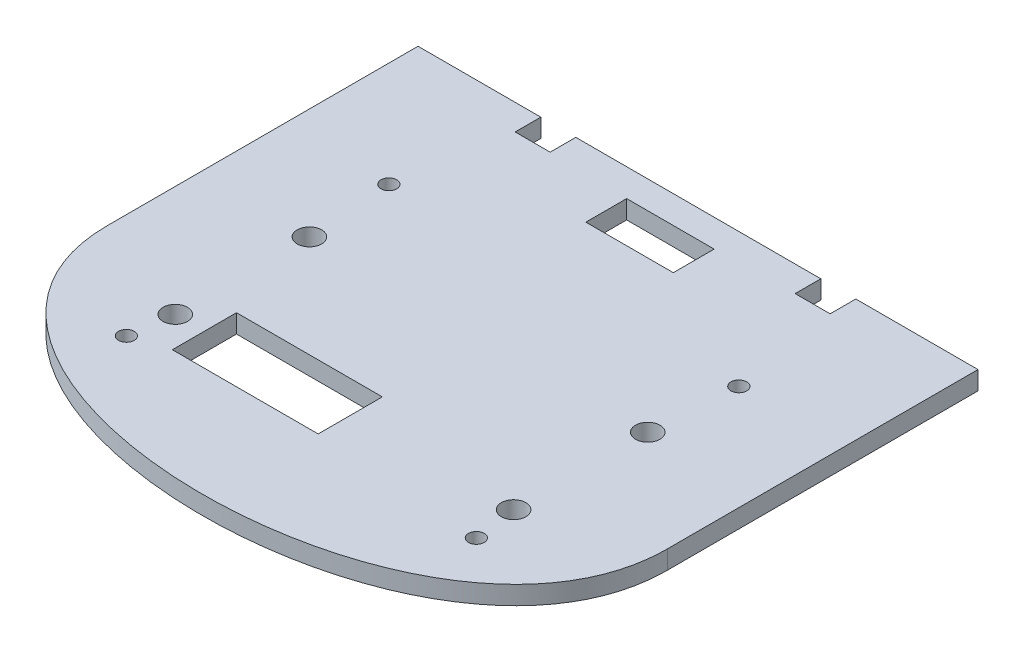
ISO-10303-21;
HEADER;
FILE_DESCRIPTION(('STEP AP214'),'2;1');
FILE_NAME('part.step','',(''),(''),'','','');
FILE_SCHEMA(('AUTOMOTIVE_DESIGN { 1 0 10303 214 1 1 1 1 }'));
ENDSEC;
DATA;
#1=APPLICATION_CONTEXT('core data for automotive mechanical design processes');
#2=APPLICATION_PROTOCOL_DEFINITION('international standard','automotive_design',2000,#1);
#3=PRODUCT_CONTEXT('',#1,'mechanical');
#4=PRODUCT('Part','Part','',(#3));
#5=PRODUCT_RELATED_PRODUCT_CATEGORY('part','',(#4));
#6=PRODUCT_DEFINITION_FORMATION('','',#4);
#7=PRODUCT_DEFINITION_CONTEXT('part definition',#1,'design');
#8=PRODUCT_DEFINITION('design','',#6,#7);
#9=PRODUCT_DEFINITION_SHAPE('','',#8);
#10=(LENGTH_UNIT() NAMED_UNIT(*) SI_UNIT(.MILLI.,.METRE.));
#11=(NAMED_UNIT(*) PLANE_ANGLE_UNIT() SI_UNIT($,.RADIAN.));
#12=(NAMED_UNIT(*) SI_UNIT($,.STERADIAN.) SOLID_ANGLE_UNIT());
#13=UNCERTAINTY_MEASURE_WITH_UNIT(LENGTH_MEASURE(1.E-05),#10,'distance_accuracy_value','');
#14=(GEOMETRIC_REPRESENTATION_CONTEXT(3) GLOBAL_UNCERTAINTY_ASSIGNED_CONTEXT((#13)) GLOBAL_UNIT_ASSIGNED_CONTEXT((#10,
#11,#12)) REPRESENTATION_CONTEXT('',''));
#15=CARTESIAN_POINT('',(0.,0.,0.));
#16=DIRECTION('',(0.,0.,1.));
#17=DIRECTION('',(1.,0.,0.));
#18=AXIS2_PLACEMENT_3D('',#15,#16,#17);
#19=CARTESIAN_POINT('',(48.,3.175,-42.5));
#20=DIRECTION('',(0.,0.,1.));
#21=DIRECTION('',(1.,0.,0.));
#22=AXIS2_PLACEMENT_3D('',#19,#20,#21);
#23=PLANE('',#22);
#24=DIRECTION('',(-1.,0.,0.));
#25=VECTOR('',#24,1.);
#26=CARTESIAN_POINT('',(48.,3.175,-42.5));
#27=LINE('',#26,#25);
#28=CARTESIAN_POINT('',(21.051144598735,3.175,-42.5));
#29=VERTEX_POINT('',#28);
#30=CARTESIAN_POINT('',(-20.948855401265,3.175,-42.4999999999998));
#31=VERTEX_POINT('',#30);
#32=EDGE_CURVE('E542',#29,#31,#27,.T.);
#33=ORIENTED_EDGE('',*,*,#32,.F.);
#34=DIRECTION('',(0.,1.,0.));
#35=VECTOR('',#34,1.);
#36=CARTESIAN_POINT('',(21.051144598735,0.,-42.5));
#37=LINE('',#36,#35);
#38=CARTESIAN_POINT('',(21.051144598735,0.,-42.5));
#39=VERTEX_POINT('',#38);
#40=EDGE_CURVE('E215',#39,#29,#37,.T.);
#41=ORIENTED_EDGE('',*,*,#40,.F.);
#42=DIRECTION('',(-1.,0.,0.));
#43=VECTOR('',#42,1.);
#44=CARTESIAN_POINT('',(48.,0.,-42.5));
#45=LINE('',#44,#43);
#46=CARTESIAN_POINT('',(-20.948855401265,0.,-42.4999999999998));
#47=VERTEX_POINT('',#46);
#48=EDGE_CURVE('E200',#39,#47,#45,.T.);
#49=ORIENTED_EDGE('',*,*,#48,.T.);
#50=DIRECTION('',(0.,1.,0.));
#51=VECTOR('',#50,1.);
#52=CARTESIAN_POINT('',(-20.948855401265,0.,-42.4999999999998));
#53=LINE('',#52,#51);
#54=EDGE_CURVE('E249',#47,#31,#53,.T.);
#55=ORIENTED_EDGE('',*,*,#54,.T.);
#56=EDGE_LOOP('',(#33,#41,#49,#55));
#57=FACE_BOUND('',#56,.T.);
#58=ADVANCED_FACE('F39',(#57),#23,.F.);
#59=CARTESIAN_POINT('',(-26.948855401265,3.175,-42.4999999999998));
#60=VERTEX_POINT('',#59);
#61=CARTESIAN_POINT('',(-48.,3.175,-42.5));
#62=VERTEX_POINT('',#61);
#63=EDGE_CURVE('E547',#60,#62,#27,.T.);
#64=ORIENTED_EDGE('',*,*,#63,.F.);
#65=DIRECTION('',(0.,1.,0.));
#66=VECTOR('',#65,1.);
#67=CARTESIAN_POINT('',(-26.948855401265,0.,-42.4999999999998));
#68=LINE('',#67,#66);
#69=CARTESIAN_POINT('',(-26.948855401265,0.,-42.4999999999998));
#70=VERTEX_POINT('',#69);
#71=EDGE_CURVE('E212',#70,#60,#68,.T.);
#72=ORIENTED_EDGE('',*,*,#71,.F.);
#73=CARTESIAN_POINT('',(-48.,0.,-42.5));
#74=VERTEX_POINT('',#73);
#75=EDGE_CURVE('E567',#70,#74,#45,.T.);
#76=ORIENTED_EDGE('',*,*,#75,.T.);
#77=DIRECTION('',(0.,-1.,0.));
#78=VECTOR('',#77,1.);
#79=CARTESIAN_POINT('',(-48.,3.175,-42.5));
#80=LINE('',#79,#78);
#81=EDGE_CURVE('E551',#62,#74,#80,.T.);
#82=ORIENTED_EDGE('',*,*,#81,.F.);
#83=EDGE_LOOP('',(#64,#72,#76,#82));
#84=FACE_BOUND('',#83,.T.);
#85=ADVANCED_FACE('F445',(#84),#23,.F.);
#86=CARTESIAN_POINT('',(-48.,3.175,-42.5));
#87=DIRECTION('',(1.,0.,0.));
#88=DIRECTION('',(0.,0.,-1.));
#89=AXIS2_PLACEMENT_3D('',#86,#87,#88);
#90=PLANE('',#89);
#91=DIRECTION('',(0.,0.,1.));
#92=VECTOR('',#91,1.);
#93=CARTESIAN_POINT('',(-48.,0.,-42.5));
#94=LINE('',#93,#92);
#95=CARTESIAN_POINT('',(-48.,0.,10.75));
#96=VERTEX_POINT('',#95);
#97=EDGE_CURVE('E415',#74,#96,#94,.T.);
#98=ORIENTED_EDGE('',*,*,#97,.T.);
#99=DIRECTION('',(0.,-1.,0.));
#100=VECTOR('',#99,1.);
#101=CARTESIAN_POINT('',(-48.,3.175,10.75));
#102=LINE('',#101,#100);
#103=CARTESIAN_POINT('',(-48.,3.175,10.75));
#104=VERTEX_POINT('',#103);
#105=EDGE_CURVE('E11',#104,#96,#102,.T.);
#106=ORIENTED_EDGE('',*,*,#105,.F.);
#107=DIRECTION('',(0.,0.,1.));
#108=VECTOR('',#107,1.);
#109=CARTESIAN_POINT('',(-48.,3.175,-42.5));
#110=LINE('',#109,#108);
#111=EDGE_CURVE('E416',#62,#104,#110,.T.);
#112=ORIENTED_EDGE('',*,*,#111,.F.);
#113=ORIENTED_EDGE('',*,*,#81,.T.);
#114=EDGE_LOOP('',(#98,#106,#112,#113));
#115=FACE_BOUND('',#114,.T.);
#116=ADVANCED_FACE('F41',(#115),#90,.F.);
#117=CARTESIAN_POINT('',(-48.,3.175,10.75));
#118=CARTESIAN_POINT('',(-48.,3.175,53.0833333333333));
#119=CARTESIAN_POINT('',(48.0000000000003,3.175,53.0833333333333));
#120=CARTESIAN_POINT('',(48.,3.175,10.75));
#121=B_SPLINE_CURVE_WITH_KNOTS('',3,(#117,#118,#119,#120),.UNSPECIFIED.,.F.,.F.,(4,4),(0.,1.),.UNSPECIFIED.);
#122=DIRECTION('',(0.,-1.,0.));
#123=VECTOR('',#122,1.);
#124=SURFACE_OF_LINEAR_EXTRUSION('',#121,#123);
#125=CARTESIAN_POINT('',(-48.,0.,10.75));
#126=CARTESIAN_POINT('',(-48.,0.,53.0833333333333));
#127=CARTESIAN_POINT('',(48.0000000000003,0.,53.0833333333333));
#128=CARTESIAN_POINT('',(48.,0.,10.75));
#129=B_SPLINE_CURVE_WITH_KNOTS('',3,(#125,#126,#127,#128),.UNSPECIFIED.,.F.,.F.,(4,4),(0.,1.),.UNSPECIFIED.);
#130=CARTESIAN_POINT('',(48.,0.,10.75));
#131=VERTEX_POINT('',#130);
#132=EDGE_CURVE('E556',#96,#131,#129,.T.);
#133=ORIENTED_EDGE('',*,*,#132,.T.);
#134=DIRECTION('',(0.,-1.,0.));
#135=VECTOR('',#134,1.);
#136=CARTESIAN_POINT('',(48.,3.175,10.75));
#137=LINE('',#136,#135);
#138=CARTESIAN_POINT('',(48.,3.175,10.75));
#139=VERTEX_POINT('',#138);
#140=EDGE_CURVE('E48',#139,#131,#137,.T.);
#141=ORIENTED_EDGE('',*,*,#140,.F.);
#142=EDGE_CURVE('E420',#104,#139,#121,.T.);
#143=ORIENTED_EDGE('',*,*,#142,.F.);
#144=ORIENTED_EDGE('',*,*,#105,.T.);
#145=EDGE_LOOP('',(#133,#141,#143,#144));
#146=FACE_BOUND('',#145,.T.);
#147=ADVANCED_FACE('F432',(#146),#124,.F.);
#148=CARTESIAN_POINT('',(48.,3.175,-42.5));
#149=DIRECTION('',(-1.,0.,0.));
#150=DIRECTION('',(0.,0.,1.));
#151=AXIS2_PLACEMENT_3D('',#148,#149,#150);
#152=PLANE('',#151);
#153=DIRECTION('',(0.,0.,-1.));
#154=VECTOR('',#153,1.);
#155=CARTESIAN_POINT('',(48.,0.,-42.5));
#156=LINE('',#155,#154);
#157=CARTESIAN_POINT('',(48.,0.,-42.5));
#158=VERTEX_POINT('',#157);
#159=EDGE_CURVE('E561',#131,#158,#156,.T.);
#160=ORIENTED_EDGE('',*,*,#159,.T.);
#161=DIRECTION('',(0.,-1.,0.));
#162=VECTOR('',#161,1.);
#163=CARTESIAN_POINT('',(48.,3.175,-42.5));
#164=LINE('',#163,#162);
#165=CARTESIAN_POINT('',(48.,3.175,-42.5));
#166=VERTEX_POINT('',#165);
#167=EDGE_CURVE('E574',#166,#158,#164,.T.);
#168=ORIENTED_EDGE('',*,*,#167,.F.);
#169=DIRECTION('',(0.,0.,-1.));
#170=VECTOR('',#169,1.);
#171=CARTESIAN_POINT('',(48.,3.175,-42.5));
#172=LINE('',#171,#170);
#173=EDGE_CURVE('E427',#139,#166,#172,.T.);
#174=ORIENTED_EDGE('',*,*,#173,.F.);
#175=ORIENTED_EDGE('',*,*,#140,.T.);
#176=EDGE_LOOP('',(#160,#168,#174,#175));
#177=FACE_BOUND('',#176,.T.);
#178=ADVANCED_FACE('F435',(#177),#152,.F.);
#179=CARTESIAN_POINT('',(27.051144598735,0.,-42.5));
#180=VERTEX_POINT('',#179);
#181=EDGE_CURVE('E421',#158,#180,#45,.T.);
#182=ORIENTED_EDGE('',*,*,#181,.T.);
#183=DIRECTION('',(0.,1.,0.));
#184=VECTOR('',#183,1.);
#185=CARTESIAN_POINT('',(27.051144598735,0.,-42.5));
#186=LINE('',#185,#184);
#187=CARTESIAN_POINT('',(27.051144598735,3.175,-42.5));
#188=VERTEX_POINT('',#187);
#189=EDGE_CURVE('E219',#180,#188,#186,.T.);
#190=ORIENTED_EDGE('',*,*,#189,.T.);
#191=EDGE_CURVE('E546',#166,#188,#27,.T.);
#192=ORIENTED_EDGE('',*,*,#191,.F.);
#193=ORIENTED_EDGE('',*,*,#167,.T.);
#194=EDGE_LOOP('',(#182,#190,#192,#193));
#195=FACE_BOUND('',#194,.T.);
#196=ADVANCED_FACE('F439',(#195),#23,.F.);
#197=CARTESIAN_POINT('',(1.196959198424E-13,3.175,42.5));
#198=DIRECTION('',(0.,-1.,0.));
#199=DIRECTION('',(0.,0.,-1.));
#200=AXIS2_PLACEMENT_3D('',#197,#198,#199);
#201=PLANE('',#200);
#202=CARTESIAN_POINT('',(29.,3.175,18.1187367018033));
#203=DIRECTION('',(0.,-1.,0.));
#204=DIRECTION('',(0.,0.,-1.));
#205=AXIS2_PLACEMENT_3D('',#202,#203,#204);
#206=CIRCLE('',#205,2.1);
#207=CARTESIAN_POINT('',(29.,3.175,16.0187367018033));
#208=VERTEX_POINT('',#207);
#209=EDGE_CURVE('E411',#208,#208,#206,.T.);
#210=ORIENTED_EDGE('',*,*,#209,.T.);
#211=EDGE_LOOP('',(#210));
#212=FACE_BOUND('',#211,.T.);
#213=CARTESIAN_POINT('',(-30.,3.175,25.5));
#214=DIRECTION('',(0.,-1.,0.));
#215=DIRECTION('',(0.,0.,-1.));
#216=AXIS2_PLACEMENT_3D('',#213,#214,#215);
#217=CIRCLE('',#216,1.35000000000001);
#218=CARTESIAN_POINT('',(-30.,3.175,24.15));
#219=VERTEX_POINT('',#218);
#220=EDGE_CURVE('E407',#219,#219,#217,.T.);
#221=ORIENTED_EDGE('',*,*,#220,.T.);
#222=EDGE_LOOP('',(#221));
#223=FACE_BOUND('',#222,.T.);
#224=CARTESIAN_POINT('',(30.,3.175,25.5));
#225=DIRECTION('',(0.,-1.,0.));
#226=DIRECTION('',(0.,0.,-1.));
#227=AXIS2_PLACEMENT_3D('',#224,#225,#226);
#228=CIRCLE('',#227,1.35000000000001);
#229=CARTESIAN_POINT('',(30.,3.175,24.15));
#230=VERTEX_POINT('',#229);
#231=EDGE_CURVE('E403',#230,#230,#228,.T.);
#232=ORIENTED_EDGE('',*,*,#231,.T.);
#233=EDGE_LOOP('',(#232));
#234=FACE_BOUND('',#233,.T.);
#235=CARTESIAN_POINT('',(30.,3.175,-19.5));
#236=DIRECTION('',(0.,-1.,0.));
#237=DIRECTION('',(0.,0.,-1.));
#238=AXIS2_PLACEMENT_3D('',#235,#236,#237);
#239=CIRCLE('',#238,1.35);
#240=CARTESIAN_POINT('',(30.,3.175,-20.85));
#241=VERTEX_POINT('',#240);
#242=EDGE_CURVE('E399',#241,#241,#239,.T.);
#243=ORIENTED_EDGE('',*,*,#242,.T.);
#244=EDGE_LOOP('',(#243));
#245=FACE_BOUND('',#244,.T.);
#246=DIRECTION('',(1.,0.,0.));
#247=VECTOR('',#246,1.);
#248=CARTESIAN_POINT('',(1.56825963677274E-13,3.175,-37.7650487579144));
#249=LINE('',#248,#247);
#250=CARTESIAN_POINT('',(-7.5,3.175,-37.7650487579144));
#251=VERTEX_POINT('',#250);
#252=CARTESIAN_POINT('',(7.5,3.175,-37.7650487579144));
#253=VERTEX_POINT('',#252);
#254=EDGE_CURVE('E383',#251,#253,#249,.T.);
#255=ORIENTED_EDGE('',*,*,#254,.T.);
#256=DIRECTION('',(0.,0.,1.));
#257=VECTOR('',#256,1.);
#258=CARTESIAN_POINT('',(7.50000000000002,3.175,42.5));
#259=LINE('',#258,#257);
#260=CARTESIAN_POINT('',(7.5,3.175,-30.7650487579144));
#261=VERTEX_POINT('',#260);
#262=EDGE_CURVE('E395',#253,#261,#259,.T.);
#263=ORIENTED_EDGE('',*,*,#262,.T.);
#264=DIRECTION('',(-1.,0.,0.));
#265=VECTOR('',#264,1.);
#266=CARTESIAN_POINT('',(0.,3.175,-30.7650487579144));
#267=LINE('',#266,#265);
#268=CARTESIAN_POINT('',(-7.5,3.175,-30.7650487579144));
#269=VERTEX_POINT('',#268);
#270=EDGE_CURVE('E391',#261,#269,#267,.T.);
#271=ORIENTED_EDGE('',*,*,#270,.T.);
#272=DIRECTION('',(0.,0.,-1.));
#273=VECTOR('',#272,1.);
#274=CARTESIAN_POINT('',(-7.5,3.175,42.5));
#275=LINE('',#274,#273);
#276=EDGE_CURVE('E387',#269,#251,#275,.T.);
#277=ORIENTED_EDGE('',*,*,#276,.T.);
#278=EDGE_LOOP('',(#255,#263,#271,#277));
#279=FACE_BOUND('',#278,.T.);
#280=CARTESIAN_POINT('',(-29.,3.175,-4.88126329819669));
#281=DIRECTION('',(0.,-1.,0.));
#282=DIRECTION('',(0.,0.,-1.));
#283=AXIS2_PLACEMENT_3D('',#280,#281,#282);
#284=CIRCLE('',#283,2.1);
#285=CARTESIAN_POINT('',(-29.,3.175,-6.98126329819669));
#286=VERTEX_POINT('',#285);
#287=EDGE_CURVE('E379',#286,#286,#284,.T.);
#288=ORIENTED_EDGE('',*,*,#287,.T.);
#289=EDGE_LOOP('',(#288));
#290=FACE_BOUND('',#289,.T.);
#291=CARTESIAN_POINT('',(-30.,3.175,-19.5));
#292=DIRECTION('',(0.,-1.,0.));
#293=DIRECTION('',(0.,0.,-1.));
#294=AXIS2_PLACEMENT_3D('',#291,#292,#293);
#295=CIRCLE('',#294,1.35);
#296=CARTESIAN_POINT('',(-30.,3.175,-20.85));
#297=VERTEX_POINT('',#296);
#298=EDGE_CURVE('E375',#297,#297,#295,.T.);
#299=ORIENTED_EDGE('',*,*,#298,.T.);
#300=EDGE_LOOP('',(#299));
#301=FACE_BOUND('',#300,.T.);
#302=CARTESIAN_POINT('',(-29.,3.175,18.1187367018033));
#303=DIRECTION('',(0.,-1.,0.));
#304=DIRECTION('',(0.,0.,-1.));
#305=AXIS2_PLACEMENT_3D('',#302,#303,#304);
#306=CIRCLE('',#305,2.1);
#307=CARTESIAN_POINT('',(-29.,3.175,16.0187367018033));
#308=VERTEX_POINT('',#307);
#309=EDGE_CURVE('E371',#308,#308,#306,.T.);
#310=ORIENTED_EDGE('',*,*,#309,.T.);
#311=EDGE_LOOP('',(#310));
#312=FACE_BOUND('',#311,.T.);
#313=CARTESIAN_POINT('',(29.,3.175,-4.8812632981967));
#314=DIRECTION('',(0.,-1.,0.));
#315=DIRECTION('',(0.,0.,-1.));
#316=AXIS2_PLACEMENT_3D('',#313,#314,#315);
#317=CIRCLE('',#316,2.1);
#318=CARTESIAN_POINT('',(29.,3.175,-6.9812632981967));
#319=VERTEX_POINT('',#318);
#320=EDGE_CURVE('E367',#319,#319,#317,.T.);
#321=ORIENTED_EDGE('',*,*,#320,.T.);
#322=EDGE_LOOP('',(#321));
#323=FACE_BOUND('',#322,.T.);
#324=DIRECTION('',(1.,0.,0.));
#325=VECTOR('',#324,1.);
#326=CARTESIAN_POINT('',(1.196959198424E-13,3.175,12.6187367018033));
#327=LINE('',#326,#325);
#328=CARTESIAN_POINT('',(-24.,3.175,12.6187367018033));
#329=VERTEX_POINT('',#328);
#330=CARTESIAN_POINT('',(0.999999999999999,3.175,12.6187367018033));
#331=VERTEX_POINT('',#330);
#332=EDGE_CURVE('E341',#329,#331,#327,.T.);
#333=ORIENTED_EDGE('',*,*,#332,.T.);
#334=DIRECTION('',(0.,0.,1.));
#335=VECTOR('',#334,1.);
#336=CARTESIAN_POINT('',(0.999999999999988,3.175,42.5));
#337=LINE('',#336,#335);
#338=CARTESIAN_POINT('',(0.999999999999995,3.175,23.6187367018033));
#339=VERTEX_POINT('',#338);
#340=EDGE_CURVE('E363',#331,#339,#337,.T.);
#341=ORIENTED_EDGE('',*,*,#340,.T.);
#342=DIRECTION('',(-1.,0.,0.));
#343=VECTOR('',#342,1.);
#344=CARTESIAN_POINT('',(1.14455316530483E-13,3.175,23.6187367018033));
#345=LINE('',#344,#343);
#346=CARTESIAN_POINT('',(-24.,3.175,23.6187367018033));
#347=VERTEX_POINT('',#346);
#348=EDGE_CURVE('E359',#339,#347,#345,.T.);
#349=ORIENTED_EDGE('',*,*,#348,.T.);
#350=DIRECTION('',(0.,0.,-1.));
#351=VECTOR('',#350,1.);
#352=CARTESIAN_POINT('',(-24.,3.175,42.5));
#353=LINE('',#352,#351);
#354=EDGE_CURVE('E355',#347,#329,#353,.T.);
#355=ORIENTED_EDGE('',*,*,#354,.T.);
#356=EDGE_LOOP('',(#333,#341,#349,#355));
#357=FACE_BOUND('',#356,.T.);
#358=DIRECTION('',(1.,0.,0.));
#359=VECTOR('',#358,1.);
#360=CARTESIAN_POINT('',(21.051144598735,3.175,-38.1));
#361=LINE('',#360,#359);
#362=CARTESIAN_POINT('',(21.051144598735,3.175,-38.1));
#363=VERTEX_POINT('',#362);
#364=CARTESIAN_POINT('',(27.051144598735,3.175,-38.1));
#365=VERTEX_POINT('',#364);
#366=EDGE_CURVE('E205',#363,#365,#361,.T.);
#367=ORIENTED_EDGE('',*,*,#366,.F.);
#368=DIRECTION('',(0.,0.,1.));
#369=VECTOR('',#368,1.);
#370=CARTESIAN_POINT('',(21.051144598735,3.175,-42.5));
#371=LINE('',#370,#369);
#372=EDGE_CURVE('E183',#29,#363,#371,.T.);
#373=ORIENTED_EDGE('',*,*,#372,.F.);
#374=ORIENTED_EDGE('',*,*,#32,.T.);
#375=DIRECTION('',(0.,0.,-1.));
#376=VECTOR('',#375,1.);
#377=CARTESIAN_POINT('',(-20.948855401265,3.175,-42.4999999999998));
#378=LINE('',#377,#376);
#379=CARTESIAN_POINT('',(-20.948855401265,3.175,-38.1));
#380=VERTEX_POINT('',#379);
#381=EDGE_CURVE('E230',#380,#31,#378,.T.);
#382=ORIENTED_EDGE('',*,*,#381,.F.);
#383=DIRECTION('',(1.,0.,0.));
#384=VECTOR('',#383,1.);
#385=CARTESIAN_POINT('',(-26.948855401265,3.175,-38.1));
#386=LINE('',#385,#384);
#387=CARTESIAN_POINT('',(-26.948855401265,3.175,-38.1));
#388=VERTEX_POINT('',#387);
#389=EDGE_CURVE('E241',#388,#380,#386,.T.);
#390=ORIENTED_EDGE('',*,*,#389,.F.);
#391=DIRECTION('',(0.,0.,1.));
#392=VECTOR('',#391,1.);
#393=CARTESIAN_POINT('',(-26.948855401265,3.175,-42.4999999999998));
#394=LINE('',#393,#392);
#395=EDGE_CURVE('E237',#60,#388,#394,.T.);
#396=ORIENTED_EDGE('',*,*,#395,.F.);
#397=ORIENTED_EDGE('',*,*,#63,.T.);
#398=ORIENTED_EDGE('',*,*,#111,.T.);
#399=ORIENTED_EDGE('',*,*,#142,.T.);
#400=ORIENTED_EDGE('',*,*,#173,.T.);
#401=ORIENTED_EDGE('',*,*,#191,.T.);
#402=DIRECTION('',(0.,0.,-1.));
#403=VECTOR('',#402,1.);
#404=CARTESIAN_POINT('',(27.051144598735,3.175,-42.5));
#405=LINE('',#404,#403);
#406=EDGE_CURVE('E202',#365,#188,#405,.T.);
#407=ORIENTED_EDGE('',*,*,#406,.F.);
#408=EDGE_LOOP('',(#367,#373,#374,#382,#390,#396,#397,#398,#399,#400,#401,#407));
#409=FACE_BOUND('',#408,.T.);
#410=ADVANCED_FACE('F443',(#212,#223,#234,#245,#279,#290,#301,#312,#323,#357,#409),#201,.F.);
#411=CARTESIAN_POINT('',(1.196959198424E-13,0.,42.5));
#412=DIRECTION('',(0.,-1.,0.));
#413=DIRECTION('',(0.,0.,-1.));
#414=AXIS2_PLACEMENT_3D('',#411,#412,#413);
#415=PLANE('',#414);
#416=DIRECTION('',(0.,0.,1.));
#417=VECTOR('',#416,1.);
#418=CARTESIAN_POINT('',(21.051144598735,0.,-42.5));
#419=LINE('',#418,#417);
#420=CARTESIAN_POINT('',(21.051144598735,0.,-38.1));
#421=VERTEX_POINT('',#420);
#422=EDGE_CURVE('E180',#39,#421,#419,.T.);
#423=ORIENTED_EDGE('',*,*,#422,.T.);
#424=DIRECTION('',(1.,0.,0.));
#425=VECTOR('',#424,1.);
#426=CARTESIAN_POINT('',(21.051144598735,0.,-38.1));
#427=LINE('',#426,#425);
#428=CARTESIAN_POINT('',(27.051144598735,0.,-38.1));
#429=VERTEX_POINT('',#428);
#430=EDGE_CURVE('E191',#421,#429,#427,.T.);
#431=ORIENTED_EDGE('',*,*,#430,.T.);
#432=DIRECTION('',(0.,0.,-1.));
#433=VECTOR('',#432,1.);
#434=CARTESIAN_POINT('',(27.051144598735,0.,-42.5));
#435=LINE('',#434,#433);
#436=EDGE_CURVE('E55',#429,#180,#435,.T.);
#437=ORIENTED_EDGE('',*,*,#436,.T.);
#438=ORIENTED_EDGE('',*,*,#181,.F.);
#439=ORIENTED_EDGE('',*,*,#159,.F.);
#440=ORIENTED_EDGE('',*,*,#132,.F.);
#441=ORIENTED_EDGE('',*,*,#97,.F.);
#442=ORIENTED_EDGE('',*,*,#75,.F.);
#443=DIRECTION('',(0.,0.,1.));
#444=VECTOR('',#443,1.);
#445=CARTESIAN_POINT('',(-26.948855401265,0.,-42.4999999999998));
#446=LINE('',#445,#444);
#447=CARTESIAN_POINT('',(-26.948855401265,0.,-38.1));
#448=VERTEX_POINT('',#447);
#449=EDGE_CURVE('E225',#70,#448,#446,.T.);
#450=ORIENTED_EDGE('',*,*,#449,.T.);
#451=DIRECTION('',(1.,0.,0.));
#452=VECTOR('',#451,1.);
#453=CARTESIAN_POINT('',(-26.948855401265,0.,-38.1));
#454=LINE('',#453,#452);
#455=CARTESIAN_POINT('',(-20.948855401265,0.,-38.1));
#456=VERTEX_POINT('',#455);
#457=EDGE_CURVE('E229',#448,#456,#454,.T.);
#458=ORIENTED_EDGE('',*,*,#457,.T.);
#459=DIRECTION('',(0.,0.,-1.));
#460=VECTOR('',#459,1.);
#461=CARTESIAN_POINT('',(-20.948855401265,0.,-42.4999999999998));
#462=LINE('',#461,#460);
#463=EDGE_CURVE('E63',#456,#47,#462,.T.);
#464=ORIENTED_EDGE('',*,*,#463,.T.);
#465=ORIENTED_EDGE('',*,*,#48,.F.);
#466=EDGE_LOOP('',(#423,#431,#437,#438,#439,#440,#441,#442,#450,#458,#464,#465));
#467=FACE_BOUND('',#466,.T.);
#468=CARTESIAN_POINT('',(29.,0.,18.1187367018033));
#469=DIRECTION('',(0.,1.,0.));
#470=DIRECTION('',(0.,0.,-1.));
#471=AXIS2_PLACEMENT_3D('',#468,#469,#470);
#472=CIRCLE('',#471,2.1);
#473=CARTESIAN_POINT('',(29.,0.,16.0187367018033));
#474=VERTEX_POINT('',#473);
#475=EDGE_CURVE('E270',#474,#474,#472,.T.);
#476=ORIENTED_EDGE('',*,*,#475,.T.);
#477=EDGE_LOOP('',(#476));
#478=FACE_BOUND('',#477,.T.);
#479=CARTESIAN_POINT('',(-30.,0.,25.5));
#480=DIRECTION('',(0.,1.,0.));
#481=DIRECTION('',(0.,0.,1.));
#482=AXIS2_PLACEMENT_3D('',#479,#480,#481);
#483=CIRCLE('',#482,1.35000000000001);
#484=CARTESIAN_POINT('',(-30.,0.,26.85));
#485=VERTEX_POINT('',#484);
#486=EDGE_CURVE('E266',#485,#485,#483,.T.);
#487=ORIENTED_EDGE('',*,*,#486,.T.);
#488=EDGE_LOOP('',(#487));
#489=FACE_BOUND('',#488,.T.);
#490=CARTESIAN_POINT('',(30.,0.,25.5));
#491=DIRECTION('',(0.,1.,0.));
#492=DIRECTION('',(0.,0.,-1.));
#493=AXIS2_PLACEMENT_3D('',#490,#491,#492);
#494=CIRCLE('',#493,1.35000000000001);
#495=CARTESIAN_POINT('',(30.,0.,24.15));
#496=VERTEX_POINT('',#495);
#497=EDGE_CURVE('E262',#496,#496,#494,.T.);
#498=ORIENTED_EDGE('',*,*,#497,.T.);
#499=EDGE_LOOP('',(#498));
#500=FACE_BOUND('',#499,.T.);
#501=CARTESIAN_POINT('',(30.,0.,-19.5));
#502=DIRECTION('',(0.,1.,0.));
#503=DIRECTION('',(0.,0.,-1.));
#504=AXIS2_PLACEMENT_3D('',#501,#502,#503);
#505=CIRCLE('',#504,1.35);
#506=CARTESIAN_POINT('',(30.,0.,-20.85));
#507=VERTEX_POINT('',#506);
#508=EDGE_CURVE('E261',#507,#507,#505,.T.);
#509=ORIENTED_EDGE('',*,*,#508,.T.);
#510=EDGE_LOOP('',(#509));
#511=FACE_BOUND('',#510,.T.);
#512=DIRECTION('',(0.,0.,-1.));
#513=VECTOR('',#512,1.);
#514=CARTESIAN_POINT('',(7.5,0.,-37.7650487579144));
#515=LINE('',#514,#513);
#516=CARTESIAN_POINT('',(7.5,0.,-30.7650487579144));
#517=VERTEX_POINT('',#516);
#518=CARTESIAN_POINT('',(7.5,0.,-37.7650487579144));
#519=VERTEX_POINT('',#518);
#520=EDGE_CURVE('E286',#517,#519,#515,.T.);
#521=ORIENTED_EDGE('',*,*,#520,.T.);
#522=DIRECTION('',(-1.,0.,0.));
#523=VECTOR('',#522,1.);
#524=CARTESIAN_POINT('',(-7.5,0.,-37.7650487579144));
#525=LINE('',#524,#523);
#526=CARTESIAN_POINT('',(-7.5,0.,-37.7650487579144));
#527=VERTEX_POINT('',#526);
#528=EDGE_CURVE('E290',#519,#527,#525,.T.);
#529=ORIENTED_EDGE('',*,*,#528,.T.);
#530=DIRECTION('',(0.,0.,1.));
#531=VECTOR('',#530,1.);
#532=CARTESIAN_POINT('',(-7.5,0.,-37.7650487579144));
#533=LINE('',#532,#531);
#534=CARTESIAN_POINT('',(-7.5,0.,-30.7650487579144));
#535=VERTEX_POINT('',#534);
#536=EDGE_CURVE('E294',#527,#535,#533,.T.);
#537=ORIENTED_EDGE('',*,*,#536,.T.);
#538=DIRECTION('',(1.,0.,0.));
#539=VECTOR('',#538,1.);
#540=CARTESIAN_POINT('',(-7.5,0.,-30.7650487579144));
#541=LINE('',#540,#539);
#542=EDGE_CURVE('E298',#535,#517,#541,.T.);
#543=ORIENTED_EDGE('',*,*,#542,.T.);
#544=EDGE_LOOP('',(#521,#529,#537,#543));
#545=FACE_BOUND('',#544,.T.);
#546=CARTESIAN_POINT('',(-29.,0.,-4.88126329819669));
#547=DIRECTION('',(0.,1.,0.));
#548=DIRECTION('',(0.,0.,1.));
#549=AXIS2_PLACEMENT_3D('',#546,#547,#548);
#550=CIRCLE('',#549,2.1);
#551=CARTESIAN_POINT('',(-29.,0.,-2.78126329819669));
#552=VERTEX_POINT('',#551);
#553=EDGE_CURVE('E282',#552,#552,#550,.T.);
#554=ORIENTED_EDGE('',*,*,#553,.T.);
#555=EDGE_LOOP('',(#554));
#556=FACE_BOUND('',#555,.T.);
#557=CARTESIAN_POINT('',(-30.,0.,-19.5));
#558=DIRECTION('',(0.,1.,0.));
#559=DIRECTION('',(0.,0.,1.));
#560=AXIS2_PLACEMENT_3D('',#557,#558,#559);
#561=CIRCLE('',#560,1.35);
#562=CARTESIAN_POINT('',(-30.,0.,-18.15));
#563=VERTEX_POINT('',#562);
#564=EDGE_CURVE('E278',#563,#563,#561,.T.);
#565=ORIENTED_EDGE('',*,*,#564,.T.);
#566=EDGE_LOOP('',(#565));
#567=FACE_BOUND('',#566,.T.);
#568=CARTESIAN_POINT('',(-29.,0.,18.1187367018033));
#569=DIRECTION('',(0.,1.,0.));
#570=DIRECTION('',(0.,0.,1.));
#571=AXIS2_PLACEMENT_3D('',#568,#569,#570);
#572=CIRCLE('',#571,2.1);
#573=CARTESIAN_POINT('',(-29.,0.,20.2187367018033));
#574=VERTEX_POINT('',#573);
#575=EDGE_CURVE('E274',#574,#574,#572,.T.);
#576=ORIENTED_EDGE('',*,*,#575,.T.);
#577=EDGE_LOOP('',(#576));
#578=FACE_BOUND('',#577,.T.);
#579=CARTESIAN_POINT('',(29.,0.,-4.8812632981967));
#580=DIRECTION('',(0.,1.,0.));
#581=DIRECTION('',(0.,0.,-1.));
#582=AXIS2_PLACEMENT_3D('',#579,#580,#581);
#583=CIRCLE('',#582,2.1);
#584=CARTESIAN_POINT('',(29.,0.,-6.9812632981967));
#585=VERTEX_POINT('',#584);
#586=EDGE_CURVE('E218',#585,#585,#583,.T.);
#587=ORIENTED_EDGE('',*,*,#586,.T.);
#588=EDGE_LOOP('',(#587));
#589=FACE_BOUND('',#588,.T.);
#590=DIRECTION('',(0.,0.,-1.));
#591=VECTOR('',#590,1.);
#592=CARTESIAN_POINT('',(0.999999999999999,0.,12.6187367018033));
#593=LINE('',#592,#591);
#594=CARTESIAN_POINT('',(0.999999999999995,0.,23.6187367018033));
#595=VERTEX_POINT('',#594);
#596=CARTESIAN_POINT('',(0.999999999999999,0.,12.6187367018033));
#597=VERTEX_POINT('',#596);
#598=EDGE_CURVE('E307',#595,#597,#593,.T.);
#599=ORIENTED_EDGE('',*,*,#598,.T.);
#600=DIRECTION('',(-1.,0.,0.));
#601=VECTOR('',#600,1.);
#602=CARTESIAN_POINT('',(-24.,0.,12.6187367018033));
#603=LINE('',#602,#601);
#604=CARTESIAN_POINT('',(-24.,0.,12.6187367018033));
#605=VERTEX_POINT('',#604);
#606=EDGE_CURVE('E324',#597,#605,#603,.T.);
#607=ORIENTED_EDGE('',*,*,#606,.T.);
#608=DIRECTION('',(0.,0.,1.));
#609=VECTOR('',#608,1.);
#610=CARTESIAN_POINT('',(-24.,0.,12.6187367018033));
#611=LINE('',#610,#609);
#612=CARTESIAN_POINT('',(-24.,0.,23.6187367018033));
#613=VERTEX_POINT('',#612);
#614=EDGE_CURVE('E328',#605,#613,#611,.T.);
#615=ORIENTED_EDGE('',*,*,#614,.T.);
#616=DIRECTION('',(1.,0.,0.));
#617=VECTOR('',#616,1.);
#618=CARTESIAN_POINT('',(-24.,0.,23.6187367018033));
#619=LINE('',#618,#617);
#620=EDGE_CURVE('E332',#613,#595,#619,.T.);
#621=ORIENTED_EDGE('',*,*,#620,.T.);
#622=EDGE_LOOP('',(#599,#607,#615,#621));
#623=FACE_BOUND('',#622,.T.);
#624=ADVANCED_FACE('F197',(#467,#478,#489,#500,#511,#545,#556,#567,#578,#589,#623),#415,.T.);
#625=CARTESIAN_POINT('',(0.999999999999999,0.,12.6187367018033));
#626=DIRECTION('',(1.,0.,0.));
#627=DIRECTION('',(0.,0.,-1.));
#628=AXIS2_PLACEMENT_3D('',#625,#626,#627);
#629=PLANE('',#628);
#630=DIRECTION('',(0.,1.,0.));
#631=VECTOR('',#630,1.);
#632=CARTESIAN_POINT('',(0.999999999999999,0.,12.6187367018033));
#633=LINE('',#632,#631);
#634=EDGE_CURVE('E336',#597,#331,#633,.T.);
#635=ORIENTED_EDGE('',*,*,#634,.F.);
#636=ORIENTED_EDGE('',*,*,#598,.F.);
#637=DIRECTION('',(0.,1.,0.));
#638=VECTOR('',#637,1.);
#639=CARTESIAN_POINT('',(0.999999999999995,0.,23.6187367018033));
#640=LINE('',#639,#638);
#641=EDGE_CURVE('E337',#595,#339,#640,.T.);
#642=ORIENTED_EDGE('',*,*,#641,.T.);
#643=ORIENTED_EDGE('',*,*,#340,.F.);
#644=EDGE_LOOP('',(#635,#636,#642,#643));
#645=FACE_BOUND('',#644,.T.);
#646=ADVANCED_FACE('F448',(#645),#629,.F.);
#647=CARTESIAN_POINT('',(-24.,0.,23.6187367018033));
#648=DIRECTION('',(0.,0.,1.));
#649=DIRECTION('',(1.,0.,0.));
#650=AXIS2_PLACEMENT_3D('',#647,#648,#649);
#651=PLANE('',#650);
#652=ORIENTED_EDGE('',*,*,#641,.F.);
#653=ORIENTED_EDGE('',*,*,#620,.F.);
#654=DIRECTION('',(0.,1.,0.));
#655=VECTOR('',#654,1.);
#656=CARTESIAN_POINT('',(-24.,0.,23.6187367018033));
#657=LINE('',#656,#655);
#658=EDGE_CURVE('E342',#613,#347,#657,.T.);
#659=ORIENTED_EDGE('',*,*,#658,.T.);
#660=ORIENTED_EDGE('',*,*,#348,.F.);
#661=EDGE_LOOP('',(#652,#653,#659,#660));
#662=FACE_BOUND('',#661,.T.);
#663=ADVANCED_FACE('F454',(#662),#651,.F.);
#664=CARTESIAN_POINT('',(-24.,0.,12.6187367018033));
#665=DIRECTION('',(-1.,0.,0.));
#666=DIRECTION('',(0.,0.,1.));
#667=AXIS2_PLACEMENT_3D('',#664,#665,#666);
#668=PLANE('',#667);
#669=ORIENTED_EDGE('',*,*,#658,.F.);
#670=ORIENTED_EDGE('',*,*,#614,.F.);
#671=DIRECTION('',(0.,1.,0.));
#672=VECTOR('',#671,1.);
#673=CARTESIAN_POINT('',(-24.,0.,12.6187367018033));
#674=LINE('',#673,#672);
#675=EDGE_CURVE('E346',#605,#329,#674,.T.);
#676=ORIENTED_EDGE('',*,*,#675,.T.);
#677=ORIENTED_EDGE('',*,*,#354,.F.);
#678=EDGE_LOOP('',(#669,#670,#676,#677));
#679=FACE_BOUND('',#678,.T.);
#680=ADVANCED_FACE('F460',(#679),#668,.F.);
#681=CARTESIAN_POINT('',(-24.,0.,12.6187367018033));
#682=DIRECTION('',(0.,0.,-1.));
#683=DIRECTION('',(-1.,0.,0.));
#684=AXIS2_PLACEMENT_3D('',#681,#682,#683);
#685=PLANE('',#684);
#686=ORIENTED_EDGE('',*,*,#675,.F.);
#687=ORIENTED_EDGE('',*,*,#606,.F.);
#688=ORIENTED_EDGE('',*,*,#634,.T.);
#689=ORIENTED_EDGE('',*,*,#332,.F.);
#690=EDGE_LOOP('',(#686,#687,#688,#689));
#691=FACE_BOUND('',#690,.T.);
#692=ADVANCED_FACE('F456',(#691),#685,.F.);
#693=CARTESIAN_POINT('',(29.,0.,-4.8812632981967));
#694=DIRECTION('',(0.,1.,0.));
#695=DIRECTION('',(0.,0.,1.));
#696=AXIS2_PLACEMENT_3D('',#693,#694,#695);
#697=CYLINDRICAL_SURFACE('',#696,2.1);
#698=ORIENTED_EDGE('',*,*,#586,.F.);
#699=EDGE_LOOP('',(#698));
#700=FACE_BOUND('',#699,.T.);
#701=ORIENTED_EDGE('',*,*,#320,.F.);
#702=EDGE_LOOP('',(#701));
#703=FACE_BOUND('',#702,.T.);
#704=ADVANCED_FACE('F459',(#700,#703),#697,.F.);
#705=CARTESIAN_POINT('',(-29.,0.,18.1187367018033));
#706=DIRECTION('',(0.,1.,0.));
#707=DIRECTION('',(0.,0.,1.));
#708=AXIS2_PLACEMENT_3D('',#705,#706,#707);
#709=CYLINDRICAL_SURFACE('',#708,2.1);
#710=ORIENTED_EDGE('',*,*,#575,.F.);
#711=EDGE_LOOP('',(#710));
#712=FACE_BOUND('',#711,.T.);
#713=ORIENTED_EDGE('',*,*,#309,.F.);
#714=EDGE_LOOP('',(#713));
#715=FACE_BOUND('',#714,.T.);
#716=ADVANCED_FACE('F490',(#712,#715),#709,.F.);
#717=CARTESIAN_POINT('',(-30.,0.,-19.5));
#718=DIRECTION('',(0.,1.,0.));
#719=DIRECTION('',(0.,0.,1.));
#720=AXIS2_PLACEMENT_3D('',#717,#718,#719);
#721=CYLINDRICAL_SURFACE('',#720,1.35);
#722=ORIENTED_EDGE('',*,*,#564,.F.);
#723=EDGE_LOOP('',(#722));
#724=FACE_BOUND('',#723,.T.);
#725=ORIENTED_EDGE('',*,*,#298,.F.);
#726=EDGE_LOOP('',(#725));
#727=FACE_BOUND('',#726,.T.);
#728=ADVANCED_FACE('F472',(#724,#727),#721,.F.);
#729=CARTESIAN_POINT('',(-29.,0.,-4.88126329819669));
#730=DIRECTION('',(0.,1.,0.));
#731=DIRECTION('',(0.,0.,1.));
#732=AXIS2_PLACEMENT_3D('',#729,#730,#731);
#733=CYLINDRICAL_SURFACE('',#732,2.1);
#734=ORIENTED_EDGE('',*,*,#553,.F.);
#735=EDGE_LOOP('',(#734));
#736=FACE_BOUND('',#735,.T.);
#737=ORIENTED_EDGE('',*,*,#287,.F.);
#738=EDGE_LOOP('',(#737));
#739=FACE_BOUND('',#738,.T.);
#740=ADVANCED_FACE('F468',(#736,#739),#733,.F.);
#741=CARTESIAN_POINT('',(7.5,0.,-37.7650487579144));
#742=DIRECTION('',(1.,0.,0.));
#743=DIRECTION('',(0.,0.,-1.));
#744=AXIS2_PLACEMENT_3D('',#741,#742,#743);
#745=PLANE('',#744);
#746=DIRECTION('',(0.,1.,0.));
#747=VECTOR('',#746,1.);
#748=CARTESIAN_POINT('',(7.5,0.,-37.7650487579144));
#749=LINE('',#748,#747);
#750=EDGE_CURVE('E302',#519,#253,#749,.T.);
#751=ORIENTED_EDGE('',*,*,#750,.F.);
#752=ORIENTED_EDGE('',*,*,#520,.F.);
#753=DIRECTION('',(0.,1.,0.));
#754=VECTOR('',#753,1.);
#755=CARTESIAN_POINT('',(7.5,0.,-30.7650487579144));
#756=LINE('',#755,#754);
#757=EDGE_CURVE('E303',#517,#261,#756,.T.);
#758=ORIENTED_EDGE('',*,*,#757,.T.);
#759=ORIENTED_EDGE('',*,*,#262,.F.);
#760=EDGE_LOOP('',(#751,#752,#758,#759));
#761=FACE_BOUND('',#760,.T.);
#762=ADVANCED_FACE('F471',(#761),#745,.F.);
#763=CARTESIAN_POINT('',(-7.5,0.,-30.7650487579144));
#764=DIRECTION('',(0.,0.,1.));
#765=DIRECTION('',(1.,0.,0.));
#766=AXIS2_PLACEMENT_3D('',#763,#764,#765);
#767=PLANE('',#766);
#768=ORIENTED_EDGE('',*,*,#757,.F.);
#769=ORIENTED_EDGE('',*,*,#542,.F.);
#770=DIRECTION('',(0.,1.,0.));
#771=VECTOR('',#770,1.);
#772=CARTESIAN_POINT('',(-7.5,0.,-30.7650487579144));
#773=LINE('',#772,#771);
#774=EDGE_CURVE('E308',#535,#269,#773,.T.);
#775=ORIENTED_EDGE('',*,*,#774,.T.);
#776=ORIENTED_EDGE('',*,*,#270,.F.);
#777=EDGE_LOOP('',(#768,#769,#775,#776));
#778=FACE_BOUND('',#777,.T.);
#779=ADVANCED_FACE('F476',(#778),#767,.F.);
#780=CARTESIAN_POINT('',(-7.5,0.,-37.7650487579144));
#781=DIRECTION('',(-1.,0.,0.));
#782=DIRECTION('',(0.,0.,1.));
#783=AXIS2_PLACEMENT_3D('',#780,#781,#782);
#784=PLANE('',#783);
#785=ORIENTED_EDGE('',*,*,#774,.F.);
#786=ORIENTED_EDGE('',*,*,#536,.F.);
#787=DIRECTION('',(0.,1.,0.));
#788=VECTOR('',#787,1.);
#789=CARTESIAN_POINT('',(-7.5,0.,-37.7650487579144));
#790=LINE('',#789,#788);
#791=EDGE_CURVE('E312',#527,#251,#790,.T.);
#792=ORIENTED_EDGE('',*,*,#791,.T.);
#793=ORIENTED_EDGE('',*,*,#276,.F.);
#794=EDGE_LOOP('',(#785,#786,#792,#793));
#795=FACE_BOUND('',#794,.T.);
#796=ADVANCED_FACE('F482',(#795),#784,.F.);
#797=CARTESIAN_POINT('',(-7.5,0.,-37.7650487579144));
#798=DIRECTION('',(0.,0.,-1.));
#799=DIRECTION('',(-1.,0.,0.));
#800=AXIS2_PLACEMENT_3D('',#797,#798,#799);
#801=PLANE('',#800);
#802=ORIENTED_EDGE('',*,*,#791,.F.);
#803=ORIENTED_EDGE('',*,*,#528,.F.);
#804=ORIENTED_EDGE('',*,*,#750,.T.);
#805=ORIENTED_EDGE('',*,*,#254,.F.);
#806=EDGE_LOOP('',(#802,#803,#804,#805));
#807=FACE_BOUND('',#806,.T.);
#808=ADVANCED_FACE('F478',(#807),#801,.F.);
#809=CARTESIAN_POINT('',(30.,0.,-19.5));
#810=DIRECTION('',(0.,1.,0.));
#811=DIRECTION('',(0.,0.,1.));
#812=AXIS2_PLACEMENT_3D('',#809,#810,#811);
#813=CYLINDRICAL_SURFACE('',#812,1.35);
#814=ORIENTED_EDGE('',*,*,#508,.F.);
#815=EDGE_LOOP('',(#814));
#816=FACE_BOUND('',#815,.T.);
#817=ORIENTED_EDGE('',*,*,#242,.F.);
#818=EDGE_LOOP('',(#817));
#819=FACE_BOUND('',#818,.T.);
#820=ADVANCED_FACE('F481',(#816,#819),#813,.F.);
#821=CARTESIAN_POINT('',(30.,0.,25.5));
#822=DIRECTION('',(0.,1.,0.));
#823=DIRECTION('',(0.,0.,1.));
#824=AXIS2_PLACEMENT_3D('',#821,#822,#823);
#825=CYLINDRICAL_SURFACE('',#824,1.35000000000001);
#826=ORIENTED_EDGE('',*,*,#497,.F.);
#827=EDGE_LOOP('',(#826));
#828=FACE_BOUND('',#827,.T.);
#829=ORIENTED_EDGE('',*,*,#231,.F.);
#830=EDGE_LOOP('',(#829));
#831=FACE_BOUND('',#830,.T.);
#832=ADVANCED_FACE('F501',(#828,#831),#825,.F.);
#833=CARTESIAN_POINT('',(-30.,0.,25.5));
#834=DIRECTION('',(0.,1.,0.));
#835=DIRECTION('',(0.,0.,1.));
#836=AXIS2_PLACEMENT_3D('',#833,#834,#835);
#837=CYLINDRICAL_SURFACE('',#836,1.35000000000001);
#838=ORIENTED_EDGE('',*,*,#486,.F.);
#839=EDGE_LOOP('',(#838));
#840=FACE_BOUND('',#839,.T.);
#841=ORIENTED_EDGE('',*,*,#220,.F.);
#842=EDGE_LOOP('',(#841));
#843=FACE_BOUND('',#842,.T.);
#844=ADVANCED_FACE('F497',(#840,#843),#837,.F.);
#845=CARTESIAN_POINT('',(29.,0.,18.1187367018033));
#846=DIRECTION('',(0.,1.,0.));
#847=DIRECTION('',(0.,0.,1.));
#848=AXIS2_PLACEMENT_3D('',#845,#846,#847);
#849=CYLINDRICAL_SURFACE('',#848,2.1);
#850=ORIENTED_EDGE('',*,*,#475,.F.);
#851=EDGE_LOOP('',(#850));
#852=FACE_BOUND('',#851,.T.);
#853=ORIENTED_EDGE('',*,*,#209,.F.);
#854=EDGE_LOOP('',(#853));
#855=FACE_BOUND('',#854,.T.);
#856=ADVANCED_FACE('F500',(#852,#855),#849,.F.);
#857=CARTESIAN_POINT('',(-26.948855401265,0.,-42.4999999999998));
#858=DIRECTION('',(-1.,0.,0.));
#859=DIRECTION('',(0.,0.,1.));
#860=AXIS2_PLACEMENT_3D('',#857,#858,#859);
#861=PLANE('',#860);
#862=ORIENTED_EDGE('',*,*,#395,.T.);
#863=DIRECTION('',(0.,1.,0.));
#864=VECTOR('',#863,1.);
#865=CARTESIAN_POINT('',(-26.948855401265,0.,-38.1));
#866=LINE('',#865,#864);
#867=EDGE_CURVE('E236',#448,#388,#866,.T.);
#868=ORIENTED_EDGE('',*,*,#867,.F.);
#869=ORIENTED_EDGE('',*,*,#449,.F.);
#870=ORIENTED_EDGE('',*,*,#71,.T.);
#871=EDGE_LOOP('',(#862,#868,#869,#870));
#872=FACE_BOUND('',#871,.T.);
#873=ADVANCED_FACE('F505',(#872),#861,.F.);
#874=CARTESIAN_POINT('',(-20.948855401265,0.,-42.4999999999998));
#875=DIRECTION('',(1.,0.,0.));
#876=DIRECTION('',(0.,0.,-1.));
#877=AXIS2_PLACEMENT_3D('',#874,#875,#876);
#878=PLANE('',#877);
#879=ORIENTED_EDGE('',*,*,#381,.T.);
#880=ORIENTED_EDGE('',*,*,#54,.F.);
#881=ORIENTED_EDGE('',*,*,#463,.F.);
#882=DIRECTION('',(0.,1.,0.));
#883=VECTOR('',#882,1.);
#884=CARTESIAN_POINT('',(-20.948855401265,0.,-38.1));
#885=LINE('',#884,#883);
#886=EDGE_CURVE('E253',#456,#380,#885,.T.);
#887=ORIENTED_EDGE('',*,*,#886,.T.);
#888=EDGE_LOOP('',(#879,#880,#881,#887));
#889=FACE_BOUND('',#888,.T.);
#890=ADVANCED_FACE('F518',(#889),#878,.F.);
#891=CARTESIAN_POINT('',(-26.948855401265,0.,-38.1));
#892=DIRECTION('',(0.,0.,1.));
#893=DIRECTION('',(1.,0.,0.));
#894=AXIS2_PLACEMENT_3D('',#891,#892,#893);
#895=PLANE('',#894);
#896=ORIENTED_EDGE('',*,*,#389,.T.);
#897=ORIENTED_EDGE('',*,*,#886,.F.);
#898=ORIENTED_EDGE('',*,*,#457,.F.);
#899=ORIENTED_EDGE('',*,*,#867,.T.);
#900=EDGE_LOOP('',(#896,#897,#898,#899));
#901=FACE_BOUND('',#900,.T.);
#902=ADVANCED_FACE('F520',(#901),#895,.F.);
#903=CARTESIAN_POINT('',(21.051144598735,0.,-42.5));
#904=DIRECTION('',(-1.,0.,0.));
#905=DIRECTION('',(0.,0.,1.));
#906=AXIS2_PLACEMENT_3D('',#903,#904,#905);
#907=PLANE('',#906);
#908=ORIENTED_EDGE('',*,*,#372,.T.);
#909=DIRECTION('',(0.,1.,0.));
#910=VECTOR('',#909,1.);
#911=CARTESIAN_POINT('',(21.051144598735,0.,-38.1));
#912=LINE('',#911,#910);
#913=EDGE_CURVE('E176',#421,#363,#912,.T.);
#914=ORIENTED_EDGE('',*,*,#913,.F.);
#915=ORIENTED_EDGE('',*,*,#422,.F.);
#916=ORIENTED_EDGE('',*,*,#40,.T.);
#917=EDGE_LOOP('',(#908,#914,#915,#916));
#918=FACE_BOUND('',#917,.T.);
#919=ADVANCED_FACE('F178',(#918),#907,.F.);
#920=CARTESIAN_POINT('',(27.051144598735,0.,-42.5));
#921=DIRECTION('',(1.,0.,0.));
#922=DIRECTION('',(0.,0.,-1.));
#923=AXIS2_PLACEMENT_3D('',#920,#921,#922);
#924=PLANE('',#923);
#925=ORIENTED_EDGE('',*,*,#406,.T.);
#926=ORIENTED_EDGE('',*,*,#189,.F.);
#927=ORIENTED_EDGE('',*,*,#436,.F.);
#928=DIRECTION('',(0.,1.,0.));
#929=VECTOR('',#928,1.);
#930=CARTESIAN_POINT('',(27.051144598735,0.,-38.1));
#931=LINE('',#930,#929);
#932=EDGE_CURVE('E188',#429,#365,#931,.T.);
#933=ORIENTED_EDGE('',*,*,#932,.T.);
#934=EDGE_LOOP('',(#925,#926,#927,#933));
#935=FACE_BOUND('',#934,.T.);
#936=ADVANCED_FACE('F528',(#935),#924,.F.);
#937=CARTESIAN_POINT('',(21.051144598735,0.,-38.1));
#938=DIRECTION('',(0.,0.,1.));
#939=DIRECTION('',(1.,0.,0.));
#940=AXIS2_PLACEMENT_3D('',#937,#938,#939);
#941=PLANE('',#940);
#942=ORIENTED_EDGE('',*,*,#366,.T.);
#943=ORIENTED_EDGE('',*,*,#932,.F.);
#944=ORIENTED_EDGE('',*,*,#430,.F.);
#945=ORIENTED_EDGE('',*,*,#913,.T.);
#946=EDGE_LOOP('',(#942,#943,#944,#945));
#947=FACE_BOUND('',#946,.T.);
#948=ADVANCED_FACE('F192',(#947),#941,.F.);
#949=CLOSED_SHELL('',(#58,#85,#116,#147,#178,#196,#410,#624,#646,#663,#680,#692,#704,#716,#728,
#740,#762,#779,#796,#808,#820,#832,#844,#856,#873,#890,#902,#919,#936,#948));
#950=MANIFOLD_SOLID_BREP('B2',#949);
#951=ADVANCED_BREP_SHAPE_REPRESENTATION('',(#18,#950),#14);
#952=SHAPE_DEFINITION_REPRESENTATION(#9,#951);
ENDSEC;
END-ISO-10303-21;
